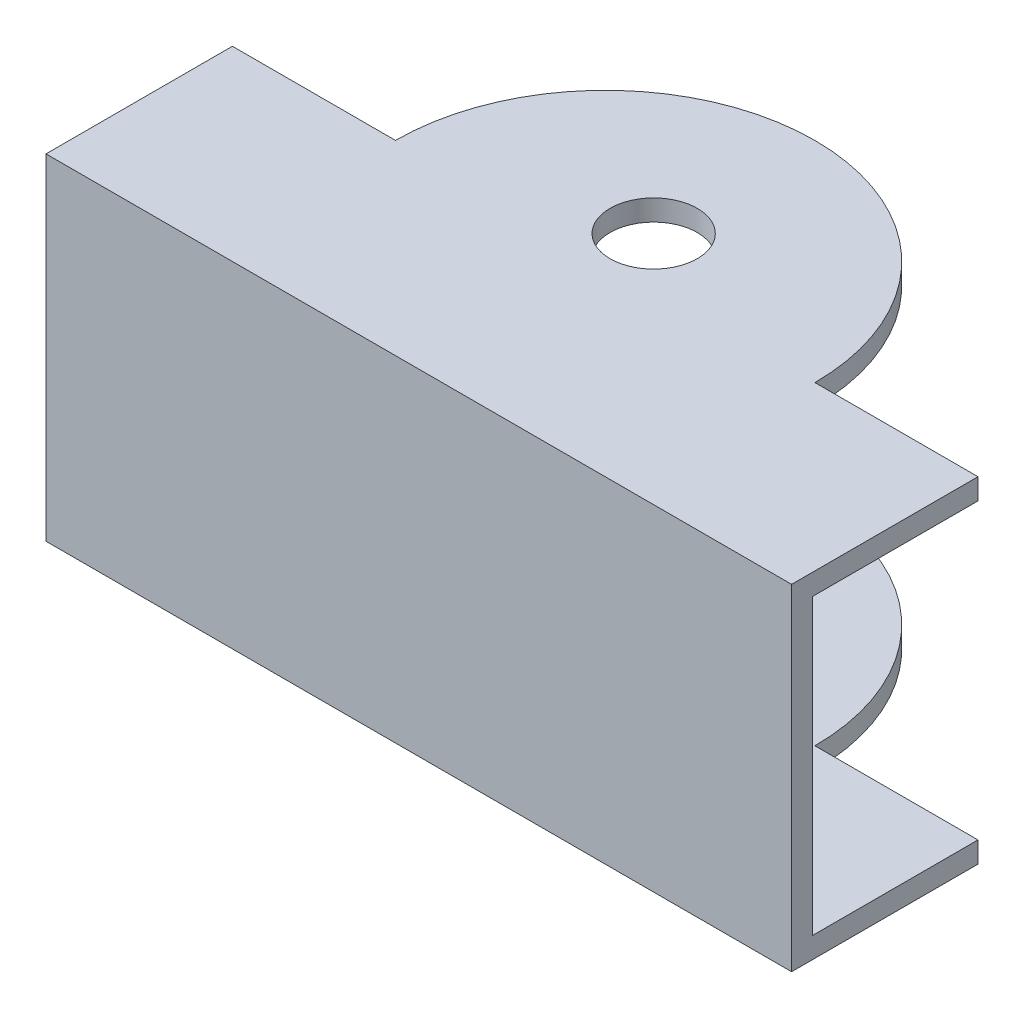
ISO-10303-21;
HEADER;
FILE_DESCRIPTION(('STEP AP214'),'2;1');
FILE_NAME('part.step','',(''),(''),'','','');
FILE_SCHEMA(('AUTOMOTIVE_DESIGN { 1 0 10303 214 1 1 1 1 }'));
ENDSEC;
DATA;
#1=APPLICATION_CONTEXT('core data for automotive mechanical design processes');
#2=APPLICATION_PROTOCOL_DEFINITION('international standard','automotive_design',2000,#1);
#3=PRODUCT_CONTEXT('',#1,'mechanical');
#4=PRODUCT('Part','Part','',(#3));
#5=PRODUCT_RELATED_PRODUCT_CATEGORY('part','',(#4));
#6=PRODUCT_DEFINITION_FORMATION('','',#4);
#7=PRODUCT_DEFINITION_CONTEXT('part definition',#1,'design');
#8=PRODUCT_DEFINITION('design','',#6,#7);
#9=PRODUCT_DEFINITION_SHAPE('','',#8);
#10=(LENGTH_UNIT() NAMED_UNIT(*) SI_UNIT(.MILLI.,.METRE.));
#11=(NAMED_UNIT(*) PLANE_ANGLE_UNIT() SI_UNIT($,.RADIAN.));
#12=(NAMED_UNIT(*) SI_UNIT($,.STERADIAN.) SOLID_ANGLE_UNIT());
#13=UNCERTAINTY_MEASURE_WITH_UNIT(LENGTH_MEASURE(1.E-05),#10,'distance_accuracy_value','');
#14=(GEOMETRIC_REPRESENTATION_CONTEXT(3) GLOBAL_UNCERTAINTY_ASSIGNED_CONTEXT((#13)) GLOBAL_UNIT_ASSIGNED_CONTEXT((#10,
#11,#12)) REPRESENTATION_CONTEXT('',''));
#15=CARTESIAN_POINT('',(0.,0.,0.));
#16=DIRECTION('',(0.,0.,1.));
#17=DIRECTION('',(1.,0.,0.));
#18=AXIS2_PLACEMENT_3D('',#15,#16,#17);
#19=CARTESIAN_POINT('',(28.2222222222222,25.4,-14.1111111111111));
#20=DIRECTION('',(0.,0.,1.));
#21=DIRECTION('',(1.,0.,0.));
#22=AXIS2_PLACEMENT_3D('',#19,#20,#21);
#23=PLANE('',#22);
#24=DIRECTION('',(0.,-1.,0.));
#25=VECTOR('',#24,1.);
#26=CARTESIAN_POINT('',(28.2222222222222,25.4,-14.1111111111111));
#27=LINE('',#26,#25);
#28=CARTESIAN_POINT('',(28.2222222222222,25.4,-14.1111111111111));
#29=VERTEX_POINT('',#28);
#30=CARTESIAN_POINT('',(28.2222222222222,23.8125,-14.1111111111111));
#31=VERTEX_POINT('',#30);
#32=EDGE_CURVE('E155',#29,#31,#27,.T.);
#33=ORIENTED_EDGE('',*,*,#32,.T.);
#34=DIRECTION('',(-1.,0.,0.));
#35=VECTOR('',#34,1.);
#36=CARTESIAN_POINT('',(28.2222222222222,23.8125,-14.1111111111111));
#37=LINE('',#36,#35);
#38=CARTESIAN_POINT('',(15.875,23.8125,-14.1111111111111));
#39=VERTEX_POINT('',#38);
#40=EDGE_CURVE('E134',#31,#39,#37,.T.);
#41=ORIENTED_EDGE('',*,*,#40,.T.);
#42=DIRECTION('',(0.,-1.,0.));
#43=VECTOR('',#42,1.);
#44=CARTESIAN_POINT('',(15.875,25.4,-14.1111111111111));
#45=LINE('',#44,#43);
#46=CARTESIAN_POINT('',(15.875,25.4,-14.1111111111111));
#47=VERTEX_POINT('',#46);
#48=EDGE_CURVE('E152',#47,#39,#45,.T.);
#49=ORIENTED_EDGE('',*,*,#48,.F.);
#50=DIRECTION('',(-1.,0.,0.));
#51=VECTOR('',#50,1.);
#52=CARTESIAN_POINT('',(28.2222222222222,25.4,-14.1111111111111));
#53=LINE('',#52,#51);
#54=EDGE_CURVE('E107',#29,#47,#53,.T.);
#55=ORIENTED_EDGE('',*,*,#54,.F.);
#56=EDGE_LOOP('',(#33,#41,#49,#55));
#57=FACE_BOUND('',#56,.T.);
#58=ADVANCED_FACE('F32',(#57),#23,.F.);
#59=CARTESIAN_POINT('',(0.,25.4,-14.1111111111111));
#60=DIRECTION('',(0.,-1.,0.));
#61=DIRECTION('',(0.,0.,-1.));
#62=AXIS2_PLACEMENT_3D('',#59,#60,#61);
#63=CYLINDRICAL_SURFACE('',#62,15.875);
#64=ORIENTED_EDGE('',*,*,#48,.T.);
#65=CARTESIAN_POINT('',(0.,23.8125,-14.1111111111111));
#66=DIRECTION('',(0.,1.,0.));
#67=DIRECTION('',(0.,0.,1.));
#68=AXIS2_PLACEMENT_3D('',#65,#66,#67);
#69=CIRCLE('',#68,15.875);
#70=CARTESIAN_POINT('',(-15.875,23.8125,-14.1111111111111));
#71=VERTEX_POINT('',#70);
#72=EDGE_CURVE('E118',#39,#71,#69,.T.);
#73=ORIENTED_EDGE('',*,*,#72,.T.);
#74=DIRECTION('',(0.,-1.,0.));
#75=VECTOR('',#74,1.);
#76=CARTESIAN_POINT('',(-15.875,25.4,-14.1111111111111));
#77=LINE('',#76,#75);
#78=CARTESIAN_POINT('',(-15.875,25.4,-14.1111111111111));
#79=VERTEX_POINT('',#78);
#80=EDGE_CURVE('E114',#79,#71,#77,.T.);
#81=ORIENTED_EDGE('',*,*,#80,.F.);
#82=CARTESIAN_POINT('',(0.,25.4,-14.1111111111111));
#83=DIRECTION('',(0.,1.,0.));
#84=DIRECTION('',(0.,0.,-1.));
#85=AXIS2_PLACEMENT_3D('',#82,#83,#84);
#86=CIRCLE('',#85,15.875);
#87=EDGE_CURVE('E100',#47,#79,#86,.T.);
#88=ORIENTED_EDGE('',*,*,#87,.F.);
#89=EDGE_LOOP('',(#64,#73,#81,#88));
#90=FACE_BOUND('',#89,.T.);
#91=ADVANCED_FACE('F115',(#90),#63,.T.);
#92=CARTESIAN_POINT('',(-28.2222222222222,25.4,-14.1111111111111));
#93=DIRECTION('',(0.,0.,1.));
#94=DIRECTION('',(1.,0.,0.));
#95=AXIS2_PLACEMENT_3D('',#92,#93,#94);
#96=PLANE('',#95);
#97=ORIENTED_EDGE('',*,*,#80,.T.);
#98=DIRECTION('',(-1.,0.,0.));
#99=VECTOR('',#98,1.);
#100=CARTESIAN_POINT('',(-28.2222222222222,23.8125,-14.1111111111111));
#101=LINE('',#100,#99);
#102=CARTESIAN_POINT('',(-28.2222222222222,23.8125,-14.1111111111111));
#103=VERTEX_POINT('',#102);
#104=EDGE_CURVE('E203',#71,#103,#101,.T.);
#105=ORIENTED_EDGE('',*,*,#104,.T.);
#106=DIRECTION('',(0.,-1.,0.));
#107=VECTOR('',#106,1.);
#108=CARTESIAN_POINT('',(-28.2222222222222,25.4,-14.1111111111111));
#109=LINE('',#108,#107);
#110=CARTESIAN_POINT('',(-28.2222222222222,25.4,-14.1111111111111));
#111=VERTEX_POINT('',#110);
#112=EDGE_CURVE('E126',#111,#103,#109,.T.);
#113=ORIENTED_EDGE('',*,*,#112,.F.);
#114=DIRECTION('',(-1.,0.,0.));
#115=VECTOR('',#114,1.);
#116=CARTESIAN_POINT('',(-28.2222222222222,25.4,-14.1111111111111));
#117=LINE('',#116,#115);
#118=EDGE_CURVE('E104',#79,#111,#117,.T.);
#119=ORIENTED_EDGE('',*,*,#118,.F.);
#120=EDGE_LOOP('',(#97,#105,#113,#119));
#121=FACE_BOUND('',#120,.T.);
#122=ADVANCED_FACE('F124',(#121),#96,.F.);
#123=CARTESIAN_POINT('',(0.,25.4,0.));
#124=DIRECTION('',(0.,0.,-1.));
#125=DIRECTION('',(-1.,0.,0.));
#126=AXIS2_PLACEMENT_3D('',#123,#124,#125);
#127=PLANE('',#126);
#128=DIRECTION('',(1.,0.,0.));
#129=VECTOR('',#128,1.);
#130=CARTESIAN_POINT('',(0.,0.,0.));
#131=LINE('',#130,#129);
#132=CARTESIAN_POINT('',(-28.2222222222222,0.,0.));
#133=VERTEX_POINT('',#132);
#134=CARTESIAN_POINT('',(28.2222222222222,0.,0.));
#135=VERTEX_POINT('',#134);
#136=EDGE_CURVE('E84',#133,#135,#131,.T.);
#137=ORIENTED_EDGE('',*,*,#136,.T.);
#138=DIRECTION('',(0.,-1.,0.));
#139=VECTOR('',#138,1.);
#140=CARTESIAN_POINT('',(28.2222222222222,25.4,0.));
#141=LINE('',#140,#139);
#142=CARTESIAN_POINT('',(28.2222222222222,25.4,0.));
#143=VERTEX_POINT('',#142);
#144=EDGE_CURVE('E41',#143,#135,#141,.T.);
#145=ORIENTED_EDGE('',*,*,#144,.F.);
#146=DIRECTION('',(1.,0.,0.));
#147=VECTOR('',#146,1.);
#148=CARTESIAN_POINT('',(0.,25.4,0.));
#149=LINE('',#148,#147);
#150=CARTESIAN_POINT('',(-28.2222222222222,25.4,0.));
#151=VERTEX_POINT('',#150);
#152=EDGE_CURVE('E90',#151,#143,#149,.T.);
#153=ORIENTED_EDGE('',*,*,#152,.F.);
#154=DIRECTION('',(0.,-1.,0.));
#155=VECTOR('',#154,1.);
#156=CARTESIAN_POINT('',(-28.2222222222222,25.4,0.));
#157=LINE('',#156,#155);
#158=EDGE_CURVE('E128',#151,#133,#157,.T.);
#159=ORIENTED_EDGE('',*,*,#158,.T.);
#160=EDGE_LOOP('',(#137,#145,#153,#159));
#161=FACE_BOUND('',#160,.T.);
#162=ADVANCED_FACE('F34',(#161),#127,.F.);
#163=CARTESIAN_POINT('',(28.2222222222222,25.4,0.));
#164=DIRECTION('',(-1.,0.,0.));
#165=DIRECTION('',(0.,0.,1.));
#166=AXIS2_PLACEMENT_3D('',#163,#164,#165);
#167=PLANE('',#166);
#168=DIRECTION('',(0.,-1.,0.));
#169=VECTOR('',#168,1.);
#170=CARTESIAN_POINT('',(28.2222222222222,23.8125,-1.5875));
#171=LINE('',#170,#169);
#172=CARTESIAN_POINT('',(28.2222222222222,23.8125,-1.5875));
#173=VERTEX_POINT('',#172);
#174=CARTESIAN_POINT('',(28.2222222222222,1.5875,-1.5875));
#175=VERTEX_POINT('',#174);
#176=EDGE_CURVE('E216',#173,#175,#171,.T.);
#177=ORIENTED_EDGE('',*,*,#176,.F.);
#178=DIRECTION('',(0.,0.,1.));
#179=VECTOR('',#178,1.);
#180=CARTESIAN_POINT('',(28.2222222222222,23.8125,-1.5875));
#181=LINE('',#180,#179);
#182=EDGE_CURVE('E214',#31,#173,#181,.T.);
#183=ORIENTED_EDGE('',*,*,#182,.F.);
#184=ORIENTED_EDGE('',*,*,#32,.F.);
#185=DIRECTION('',(0.,0.,-1.));
#186=VECTOR('',#185,1.);
#187=CARTESIAN_POINT('',(28.2222222222222,25.4,0.));
#188=LINE('',#187,#186);
#189=EDGE_CURVE('E166',#143,#29,#188,.T.);
#190=ORIENTED_EDGE('',*,*,#189,.F.);
#191=ORIENTED_EDGE('',*,*,#144,.T.);
#192=DIRECTION('',(0.,0.,-1.));
#193=VECTOR('',#192,1.);
#194=CARTESIAN_POINT('',(28.2222222222222,0.,0.));
#195=LINE('',#194,#193);
#196=CARTESIAN_POINT('',(28.2222222222222,0.,-14.1111111111111));
#197=VERTEX_POINT('',#196);
#198=EDGE_CURVE('E133',#135,#197,#195,.T.);
#199=ORIENTED_EDGE('',*,*,#198,.T.);
#200=CARTESIAN_POINT('',(28.2222222222222,1.5875,-14.1111111111111));
#201=VERTEX_POINT('',#200);
#202=EDGE_CURVE('E154',#201,#197,#27,.T.);
#203=ORIENTED_EDGE('',*,*,#202,.F.);
#204=DIRECTION('',(0.,0.,-1.));
#205=VECTOR('',#204,1.);
#206=CARTESIAN_POINT('',(28.2222222222222,1.5875,-1.5875));
#207=LINE('',#206,#205);
#208=EDGE_CURVE('E182',#175,#201,#207,.T.);
#209=ORIENTED_EDGE('',*,*,#208,.F.);
#210=EDGE_LOOP('',(#177,#183,#184,#190,#191,#199,#203,#209));
#211=FACE_BOUND('',#210,.T.);
#212=ADVANCED_FACE('F162',(#211),#167,.F.);
#213=CARTESIAN_POINT('',(15.875,1.5875,-14.1111111111111));
#214=VERTEX_POINT('',#213);
#215=CARTESIAN_POINT('',(15.875,0.,-14.1111111111111));
#216=VERTEX_POINT('',#215);
#217=EDGE_CURVE('E121',#214,#216,#45,.T.);
#218=ORIENTED_EDGE('',*,*,#217,.F.);
#219=DIRECTION('',(1.,0.,0.));
#220=VECTOR('',#219,1.);
#221=CARTESIAN_POINT('',(28.2222222222222,1.5875,-14.1111111111111));
#222=LINE('',#221,#220);
#223=EDGE_CURVE('E178',#214,#201,#222,.T.);
#224=ORIENTED_EDGE('',*,*,#223,.T.);
#225=ORIENTED_EDGE('',*,*,#202,.T.);
#226=DIRECTION('',(-1.,0.,0.));
#227=VECTOR('',#226,1.);
#228=CARTESIAN_POINT('',(28.2222222222222,0.,-14.1111111111111));
#229=LINE('',#228,#227);
#230=EDGE_CURVE('E137',#197,#216,#229,.T.);
#231=ORIENTED_EDGE('',*,*,#230,.T.);
#232=EDGE_LOOP('',(#218,#224,#225,#231));
#233=FACE_BOUND('',#232,.T.);
#234=ADVANCED_FACE('F173',(#233),#23,.F.);
#235=CARTESIAN_POINT('',(-15.875,1.5875,-14.1111111111111));
#236=VERTEX_POINT('',#235);
#237=CARTESIAN_POINT('',(-15.875,0.,-14.1111111111111));
#238=VERTEX_POINT('',#237);
#239=EDGE_CURVE('E122',#236,#238,#77,.T.);
#240=ORIENTED_EDGE('',*,*,#239,.F.);
#241=CARTESIAN_POINT('',(0.,1.5875,-14.1111111111111));
#242=DIRECTION('',(0.,-1.,0.));
#243=DIRECTION('',(0.,0.,-1.));
#244=AXIS2_PLACEMENT_3D('',#241,#242,#243);
#245=CIRCLE('',#244,15.875);
#246=EDGE_CURVE('E231',#236,#214,#245,.T.);
#247=ORIENTED_EDGE('',*,*,#246,.T.);
#248=ORIENTED_EDGE('',*,*,#217,.T.);
#249=CARTESIAN_POINT('',(0.,0.,-14.1111111111111));
#250=DIRECTION('',(0.,1.,0.));
#251=DIRECTION('',(0.,0.,-1.));
#252=AXIS2_PLACEMENT_3D('',#249,#250,#251);
#253=CIRCLE('',#252,15.875);
#254=EDGE_CURVE('E140',#216,#238,#253,.T.);
#255=ORIENTED_EDGE('',*,*,#254,.T.);
#256=EDGE_LOOP('',(#240,#247,#248,#255));
#257=FACE_BOUND('',#256,.T.);
#258=ADVANCED_FACE('F249',(#257),#63,.T.);
#259=CARTESIAN_POINT('',(-28.2222222222222,1.5875,-14.1111111111111));
#260=VERTEX_POINT('',#259);
#261=CARTESIAN_POINT('',(-28.2222222222222,0.,-14.1111111111111));
#262=VERTEX_POINT('',#261);
#263=EDGE_CURVE('E150',#260,#262,#109,.T.);
#264=ORIENTED_EDGE('',*,*,#263,.F.);
#265=DIRECTION('',(1.,0.,0.));
#266=VECTOR('',#265,1.);
#267=CARTESIAN_POINT('',(-28.2222222222222,1.5875,-14.1111111111111));
#268=LINE('',#267,#266);
#269=EDGE_CURVE('E48',#260,#236,#268,.T.);
#270=ORIENTED_EDGE('',*,*,#269,.T.);
#271=ORIENTED_EDGE('',*,*,#239,.T.);
#272=DIRECTION('',(-1.,0.,0.));
#273=VECTOR('',#272,1.);
#274=CARTESIAN_POINT('',(-28.2222222222222,0.,-14.1111111111111));
#275=LINE('',#274,#273);
#276=EDGE_CURVE('E143',#238,#262,#275,.T.);
#277=ORIENTED_EDGE('',*,*,#276,.T.);
#278=EDGE_LOOP('',(#264,#270,#271,#277));
#279=FACE_BOUND('',#278,.T.);
#280=ADVANCED_FACE('F242',(#279),#96,.F.);
#281=CARTESIAN_POINT('',(-28.2222222222222,25.4,0.));
#282=DIRECTION('',(1.,0.,0.));
#283=DIRECTION('',(0.,0.,-1.));
#284=AXIS2_PLACEMENT_3D('',#281,#282,#283);
#285=PLANE('',#284);
#286=ORIENTED_EDGE('',*,*,#112,.T.);
#287=DIRECTION('',(0.,0.,1.));
#288=VECTOR('',#287,1.);
#289=CARTESIAN_POINT('',(-28.2222222222222,23.8125,0.));
#290=LINE('',#289,#288);
#291=CARTESIAN_POINT('',(-28.2222222222222,23.8125,-1.5875));
#292=VERTEX_POINT('',#291);
#293=EDGE_CURVE('E11',#103,#292,#290,.T.);
#294=ORIENTED_EDGE('',*,*,#293,.T.);
#295=DIRECTION('',(0.,-1.,0.));
#296=VECTOR('',#295,1.);
#297=CARTESIAN_POINT('',(-28.2222222222222,23.8125,-1.5875));
#298=LINE('',#297,#296);
#299=CARTESIAN_POINT('',(-28.2222222222222,1.5875,-1.5875));
#300=VERTEX_POINT('',#299);
#301=EDGE_CURVE('E218',#292,#300,#298,.T.);
#302=ORIENTED_EDGE('',*,*,#301,.T.);
#303=DIRECTION('',(0.,0.,-1.));
#304=VECTOR('',#303,1.);
#305=CARTESIAN_POINT('',(-28.2222222222222,1.5875,-1.5875));
#306=LINE('',#305,#304);
#307=EDGE_CURVE('E221',#300,#260,#306,.T.);
#308=ORIENTED_EDGE('',*,*,#307,.T.);
#309=ORIENTED_EDGE('',*,*,#263,.T.);
#310=DIRECTION('',(0.,0.,1.));
#311=VECTOR('',#310,1.);
#312=CARTESIAN_POINT('',(-28.2222222222222,0.,0.));
#313=LINE('',#312,#311);
#314=EDGE_CURVE('E146',#262,#133,#313,.T.);
#315=ORIENTED_EDGE('',*,*,#314,.T.);
#316=ORIENTED_EDGE('',*,*,#158,.F.);
#317=DIRECTION('',(0.,0.,1.));
#318=VECTOR('',#317,1.);
#319=CARTESIAN_POINT('',(-28.2222222222222,25.4,0.));
#320=LINE('',#319,#318);
#321=EDGE_CURVE('E57',#111,#151,#320,.T.);
#322=ORIENTED_EDGE('',*,*,#321,.F.);
#323=EDGE_LOOP('',(#286,#294,#302,#308,#309,#315,#316,#322));
#324=FACE_BOUND('',#323,.T.);
#325=ADVANCED_FACE('F235',(#324),#285,.F.);
#326=CARTESIAN_POINT('',(0.,25.4,-14.1111111111111));
#327=DIRECTION('',(0.,-1.,0.));
#328=DIRECTION('',(0.,0.,-1.));
#329=AXIS2_PLACEMENT_3D('',#326,#327,#328);
#330=PLANE('',#329);
#331=CARTESIAN_POINT('',(0.,25.4,-17.78));
#332=DIRECTION('',(0.,1.,0.));
#333=DIRECTION('',(0.,0.,1.));
#334=AXIS2_PLACEMENT_3D('',#331,#332,#333);
#335=CIRCLE('',#334,3.302);
#336=CARTESIAN_POINT('',(0.,25.4,-14.478));
#337=VERTEX_POINT('',#336);
#338=EDGE_CURVE('E291',#337,#337,#335,.T.);
#339=ORIENTED_EDGE('',*,*,#338,.F.);
#340=EDGE_LOOP('',(#339));
#341=FACE_BOUND('',#340,.T.);
#342=ORIENTED_EDGE('',*,*,#152,.T.);
#343=ORIENTED_EDGE('',*,*,#189,.T.);
#344=ORIENTED_EDGE('',*,*,#54,.T.);
#345=ORIENTED_EDGE('',*,*,#87,.T.);
#346=ORIENTED_EDGE('',*,*,#118,.T.);
#347=ORIENTED_EDGE('',*,*,#321,.T.);
#348=EDGE_LOOP('',(#342,#343,#344,#345,#346,#347));
#349=FACE_BOUND('',#348,.T.);
#350=ADVANCED_FACE('F102',(#341,#349),#330,.F.);
#351=CARTESIAN_POINT('',(0.,0.,-14.1111111111111));
#352=DIRECTION('',(0.,-1.,0.));
#353=DIRECTION('',(0.,0.,-1.));
#354=AXIS2_PLACEMENT_3D('',#351,#352,#353);
#355=PLANE('',#354);
#356=CARTESIAN_POINT('',(0.,0.,-17.78));
#357=DIRECTION('',(0.,1.,0.));
#358=DIRECTION('',(0.,0.,1.));
#359=AXIS2_PLACEMENT_3D('',#356,#357,#358);
#360=CIRCLE('',#359,3.302);
#361=CARTESIAN_POINT('',(0.,0.,-14.478));
#362=VERTEX_POINT('',#361);
#363=EDGE_CURVE('E297',#362,#362,#360,.T.);
#364=ORIENTED_EDGE('',*,*,#363,.T.);
#365=EDGE_LOOP('',(#364));
#366=FACE_BOUND('',#365,.T.);
#367=ORIENTED_EDGE('',*,*,#136,.F.);
#368=ORIENTED_EDGE('',*,*,#314,.F.);
#369=ORIENTED_EDGE('',*,*,#276,.F.);
#370=ORIENTED_EDGE('',*,*,#254,.F.);
#371=ORIENTED_EDGE('',*,*,#230,.F.);
#372=ORIENTED_EDGE('',*,*,#198,.F.);
#373=EDGE_LOOP('',(#367,#368,#369,#370,#371,#372));
#374=FACE_BOUND('',#373,.T.);
#375=ADVANCED_FACE('F168',(#366,#374),#355,.T.);
#376=CARTESIAN_POINT('',(-28.2222222222222,23.8125,-1.5875));
#377=DIRECTION('',(0.,1.,0.));
#378=DIRECTION('',(0.,0.,1.));
#379=AXIS2_PLACEMENT_3D('',#376,#377,#378);
#380=PLANE('',#379);
#381=CARTESIAN_POINT('',(0.,23.8125,-17.78));
#382=DIRECTION('',(0.,1.,0.));
#383=DIRECTION('',(0.,0.,1.));
#384=AXIS2_PLACEMENT_3D('',#381,#382,#383);
#385=CIRCLE('',#384,3.302);
#386=CARTESIAN_POINT('',(0.,23.8125,-14.478));
#387=VERTEX_POINT('',#386);
#388=EDGE_CURVE('E294',#387,#387,#385,.T.);
#389=ORIENTED_EDGE('',*,*,#388,.T.);
#390=EDGE_LOOP('',(#389));
#391=FACE_BOUND('',#390,.T.);
#392=ORIENTED_EDGE('',*,*,#182,.T.);
#393=DIRECTION('',(1.,0.,0.));
#394=VECTOR('',#393,1.);
#395=CARTESIAN_POINT('',(-28.2222222222222,23.8125,-1.5875));
#396=LINE('',#395,#394);
#397=EDGE_CURVE('E226',#292,#173,#396,.T.);
#398=ORIENTED_EDGE('',*,*,#397,.F.);
#399=ORIENTED_EDGE('',*,*,#293,.F.);
#400=ORIENTED_EDGE('',*,*,#104,.F.);
#401=ORIENTED_EDGE('',*,*,#72,.F.);
#402=ORIENTED_EDGE('',*,*,#40,.F.);
#403=EDGE_LOOP('',(#392,#398,#399,#400,#401,#402));
#404=FACE_BOUND('',#403,.T.);
#405=ADVANCED_FACE('F206',(#391,#404),#380,.F.);
#406=CARTESIAN_POINT('',(-28.2222222222222,1.5875,-1.5875));
#407=DIRECTION('',(0.,-1.,0.));
#408=DIRECTION('',(0.,0.,-1.));
#409=AXIS2_PLACEMENT_3D('',#406,#407,#408);
#410=PLANE('',#409);
#411=CARTESIAN_POINT('',(0.,1.5875,-17.78));
#412=DIRECTION('',(0.,-1.,0.));
#413=DIRECTION('',(0.,0.,-1.));
#414=AXIS2_PLACEMENT_3D('',#411,#412,#413);
#415=CIRCLE('',#414,3.302);
#416=CARTESIAN_POINT('',(0.,1.5875,-21.082));
#417=VERTEX_POINT('',#416);
#418=EDGE_CURVE('E36',#417,#417,#415,.T.);
#419=ORIENTED_EDGE('',*,*,#418,.T.);
#420=EDGE_LOOP('',(#419));
#421=FACE_BOUND('',#420,.T.);
#422=ORIENTED_EDGE('',*,*,#246,.F.);
#423=ORIENTED_EDGE('',*,*,#269,.F.);
#424=ORIENTED_EDGE('',*,*,#307,.F.);
#425=DIRECTION('',(1.,0.,0.));
#426=VECTOR('',#425,1.);
#427=CARTESIAN_POINT('',(-28.2222222222222,1.5875,-1.5875));
#428=LINE('',#427,#426);
#429=EDGE_CURVE('E228',#300,#175,#428,.T.);
#430=ORIENTED_EDGE('',*,*,#429,.T.);
#431=ORIENTED_EDGE('',*,*,#208,.T.);
#432=ORIENTED_EDGE('',*,*,#223,.F.);
#433=EDGE_LOOP('',(#422,#423,#424,#430,#431,#432));
#434=FACE_BOUND('',#433,.T.);
#435=ADVANCED_FACE('F273',(#421,#434),#410,.F.);
#436=CARTESIAN_POINT('',(-28.2222222222222,23.8125,-1.5875));
#437=DIRECTION('',(0.,0.,1.));
#438=DIRECTION('',(0.,-1.,0.));
#439=AXIS2_PLACEMENT_3D('',#436,#437,#438);
#440=PLANE('',#439);
#441=ORIENTED_EDGE('',*,*,#176,.T.);
#442=ORIENTED_EDGE('',*,*,#429,.F.);
#443=ORIENTED_EDGE('',*,*,#301,.F.);
#444=ORIENTED_EDGE('',*,*,#397,.T.);
#445=EDGE_LOOP('',(#441,#442,#443,#444));
#446=FACE_BOUND('',#445,.T.);
#447=ADVANCED_FACE('F269',(#446),#440,.F.);
#448=CARTESIAN_POINT('',(0.,0.,-17.78));
#449=DIRECTION('',(0.,1.,0.));
#450=DIRECTION('',(0.,0.,1.));
#451=AXIS2_PLACEMENT_3D('',#448,#449,#450);
#452=CYLINDRICAL_SURFACE('',#451,3.302);
#453=ORIENTED_EDGE('',*,*,#363,.F.);
#454=EDGE_LOOP('',(#453));
#455=FACE_BOUND('',#454,.T.);
#456=ORIENTED_EDGE('',*,*,#418,.F.);
#457=EDGE_LOOP('',(#456));
#458=FACE_BOUND('',#457,.T.);
#459=ADVANCED_FACE('F272',(#455,#458),#452,.F.);
#460=ORIENTED_EDGE('',*,*,#338,.T.);
#461=EDGE_LOOP('',(#460));
#462=FACE_BOUND('',#461,.T.);
#463=ORIENTED_EDGE('',*,*,#388,.F.);
#464=EDGE_LOOP('',(#463));
#465=FACE_BOUND('',#464,.T.);
#466=ADVANCED_FACE('F281',(#462,#465),#452,.F.);
#467=CLOSED_SHELL('',(#58,#91,#122,#162,#212,#234,#258,#280,#325,#350,#375,#405,#435,#447,#459,#466));
#468=MANIFOLD_SOLID_BREP('B2',#467);
#469=ADVANCED_BREP_SHAPE_REPRESENTATION('',(#18,#468),#14);
#470=SHAPE_DEFINITION_REPRESENTATION(#9,#469);
ENDSEC;
END-ISO-10303-21;
